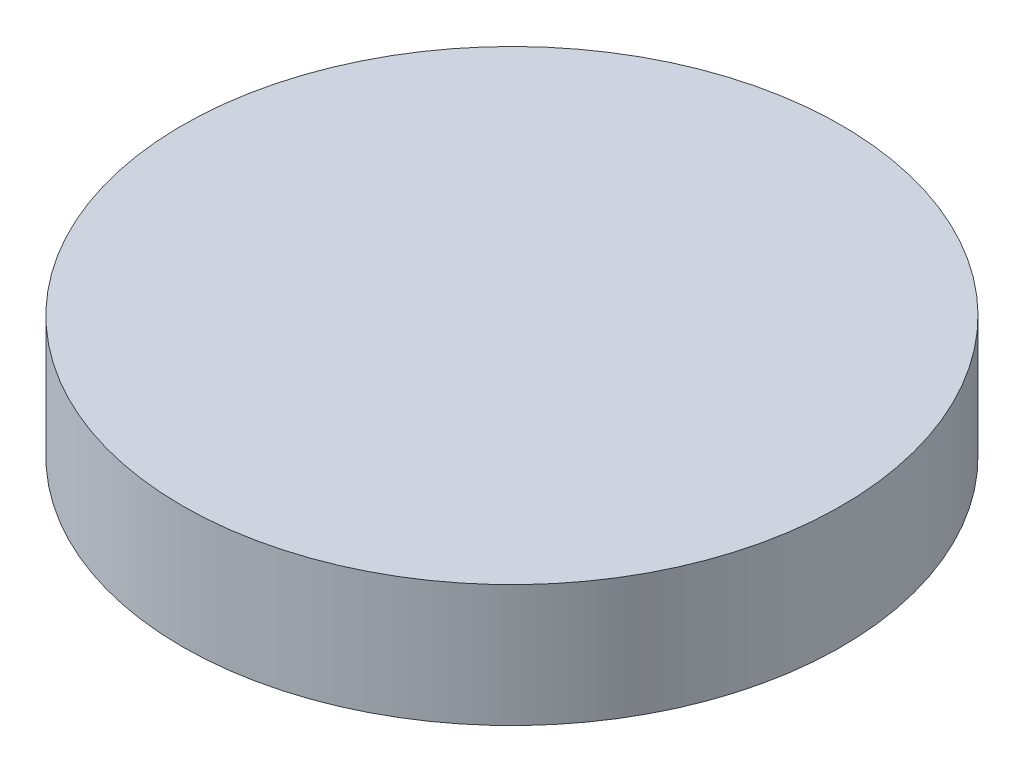
ISO-10303-21;
HEADER;
FILE_DESCRIPTION(('STEP AP214'),'2;1');
FILE_NAME('part.step','',(''),(''),'','','');
FILE_SCHEMA(('AUTOMOTIVE_DESIGN { 1 0 10303 214 1 1 1 1 }'));
ENDSEC;
DATA;
#1=APPLICATION_CONTEXT('core data for automotive mechanical design processes');
#2=APPLICATION_PROTOCOL_DEFINITION('international standard','automotive_design',2000,#1);
#3=PRODUCT_CONTEXT('',#1,'mechanical');
#4=PRODUCT('Part','Part','',(#3));
#5=PRODUCT_RELATED_PRODUCT_CATEGORY('part','',(#4));
#6=PRODUCT_DEFINITION_FORMATION('','',#4);
#7=PRODUCT_DEFINITION_CONTEXT('part definition',#1,'design');
#8=PRODUCT_DEFINITION('design','',#6,#7);
#9=PRODUCT_DEFINITION_SHAPE('','',#8);
#10=(LENGTH_UNIT() NAMED_UNIT(*) SI_UNIT(.MILLI.,.METRE.));
#11=(NAMED_UNIT(*) PLANE_ANGLE_UNIT() SI_UNIT($,.RADIAN.));
#12=(NAMED_UNIT(*) SI_UNIT($,.STERADIAN.) SOLID_ANGLE_UNIT());
#13=UNCERTAINTY_MEASURE_WITH_UNIT(LENGTH_MEASURE(1.E-05),#10,'distance_accuracy_value','');
#14=(GEOMETRIC_REPRESENTATION_CONTEXT(3) GLOBAL_UNCERTAINTY_ASSIGNED_CONTEXT((#13)) GLOBAL_UNIT_ASSIGNED_CONTEXT((#10,
#11,#12)) REPRESENTATION_CONTEXT('',''));
#15=CARTESIAN_POINT('',(0.,0.,0.));
#16=DIRECTION('',(0.,0.,1.));
#17=DIRECTION('',(1.,0.,0.));
#18=AXIS2_PLACEMENT_3D('',#15,#16,#17);
#19=CARTESIAN_POINT('',(0.,6.35,0.));
#20=DIRECTION('',(0.,-1.,0.));
#21=DIRECTION('',(0.,0.,-1.));
#22=AXIS2_PLACEMENT_3D('',#19,#20,#21);
#23=CYLINDRICAL_SURFACE('',#22,17.145);
#24=CARTESIAN_POINT('',(0.,6.35,0.));
#25=DIRECTION('',(0.,1.,0.));
#26=DIRECTION('',(0.,0.,1.));
#27=AXIS2_PLACEMENT_3D('',#24,#25,#26);
#28=CIRCLE('',#27,17.145);
#29=CARTESIAN_POINT('',(0.,6.35,17.145));
#30=VERTEX_POINT('',#29);
#31=EDGE_CURVE('E10',#30,#30,#28,.T.);
#32=ORIENTED_EDGE('',*,*,#31,.F.);
#33=EDGE_LOOP('',(#32));
#34=FACE_BOUND('',#33,.T.);
#35=CARTESIAN_POINT('',(0.,0.,0.));
#36=DIRECTION('',(0.,1.,0.));
#37=DIRECTION('',(0.,0.,1.));
#38=AXIS2_PLACEMENT_3D('',#35,#36,#37);
#39=CIRCLE('',#38,17.145);
#40=CARTESIAN_POINT('',(0.,0.,17.145));
#41=VERTEX_POINT('',#40);
#42=EDGE_CURVE('E34',#41,#41,#39,.T.);
#43=ORIENTED_EDGE('',*,*,#42,.T.);
#44=EDGE_LOOP('',(#43));
#45=FACE_BOUND('',#44,.T.);
#46=ADVANCED_FACE('F31',(#34,#45),#23,.T.);
#47=CARTESIAN_POINT('',(0.,6.35,0.));
#48=DIRECTION('',(0.,1.,0.));
#49=DIRECTION('',(0.,0.,1.));
#50=AXIS2_PLACEMENT_3D('',#47,#48,#49);
#51=PLANE('',#50);
#52=ORIENTED_EDGE('',*,*,#31,.T.);
#53=EDGE_LOOP('',(#52));
#54=FACE_BOUND('',#53,.T.);
#55=ADVANCED_FACE('F46',(#54),#51,.T.);
#56=CARTESIAN_POINT('',(0.,0.,0.));
#57=DIRECTION('',(0.,1.,0.));
#58=DIRECTION('',(0.,0.,1.));
#59=AXIS2_PLACEMENT_3D('',#56,#57,#58);
#60=PLANE('',#59);
#61=ORIENTED_EDGE('',*,*,#42,.F.);
#62=EDGE_LOOP('',(#61));
#63=FACE_BOUND('',#62,.T.);
#64=ADVANCED_FACE('F44',(#63),#60,.F.);
#65=CLOSED_SHELL('',(#46,#55,#64));
#66=MANIFOLD_SOLID_BREP('B2',#65);
#67=ADVANCED_BREP_SHAPE_REPRESENTATION('',(#18,#66),#14);
#68=SHAPE_DEFINITION_REPRESENTATION(#9,#67);
ENDSEC;
END-ISO-10303-21;
